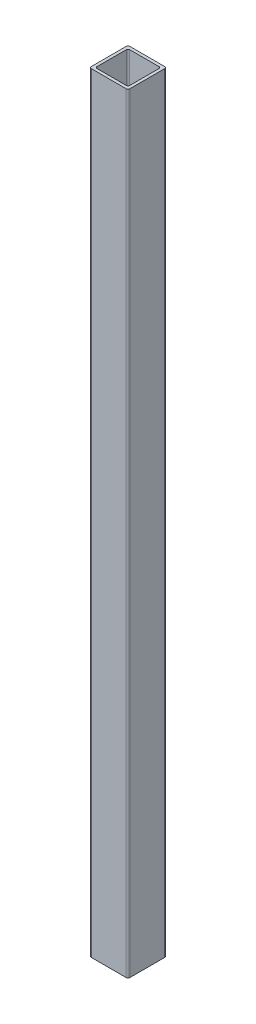
ISO-10303-21;
HEADER;
FILE_DESCRIPTION(('STEP AP214'),'2;1');
FILE_NAME('part.step','',(''),(''),'','','');
FILE_SCHEMA(('AUTOMOTIVE_DESIGN { 1 0 10303 214 1 1 1 1 }'));
ENDSEC;
DATA;
#1=APPLICATION_CONTEXT('core data for automotive mechanical design processes');
#2=APPLICATION_PROTOCOL_DEFINITION('international standard','automotive_design',2000,#1);
#3=PRODUCT_CONTEXT('',#1,'mechanical');
#4=PRODUCT('Part','Part','',(#3));
#5=PRODUCT_RELATED_PRODUCT_CATEGORY('part','',(#4));
#6=PRODUCT_DEFINITION_FORMATION('','',#4);
#7=PRODUCT_DEFINITION_CONTEXT('part definition',#1,'design');
#8=PRODUCT_DEFINITION('design','',#6,#7);
#9=PRODUCT_DEFINITION_SHAPE('','',#8);
#10=(LENGTH_UNIT() NAMED_UNIT(*) SI_UNIT(.MILLI.,.METRE.));
#11=(NAMED_UNIT(*) PLANE_ANGLE_UNIT() SI_UNIT($,.RADIAN.));
#12=(NAMED_UNIT(*) SI_UNIT($,.STERADIAN.) SOLID_ANGLE_UNIT());
#13=UNCERTAINTY_MEASURE_WITH_UNIT(LENGTH_MEASURE(1.E-05),#10,'distance_accuracy_value','');
#14=(GEOMETRIC_REPRESENTATION_CONTEXT(3) GLOBAL_UNCERTAINTY_ASSIGNED_CONTEXT((#13)) GLOBAL_UNIT_ASSIGNED_CONTEXT((#10,
#11,#12)) REPRESENTATION_CONTEXT('',''));
#15=CARTESIAN_POINT('',(0.,0.,0.));
#16=DIRECTION('',(0.,0.,1.));
#17=DIRECTION('',(1.,0.,0.));
#18=AXIS2_PLACEMENT_3D('',#15,#16,#17);
#19=CARTESIAN_POINT('',(-28.575,1270.,-28.575));
#20=DIRECTION('',(0.,-1.,0.));
#21=DIRECTION('',(0.,0.,-1.));
#22=AXIS2_PLACEMENT_3D('',#19,#20,#21);
#23=CYLINDRICAL_SURFACE('',#22,3.175);
#24=CARTESIAN_POINT('',(-28.575,0.,-28.575));
#25=DIRECTION('',(0.,1.,0.));
#26=DIRECTION('',(0.,0.,1.));
#27=AXIS2_PLACEMENT_3D('',#24,#25,#26);
#28=CIRCLE('',#27,3.175);
#29=CARTESIAN_POINT('',(-28.575,0.,-31.75));
#30=VERTEX_POINT('',#29);
#31=CARTESIAN_POINT('',(-31.75,0.,-28.575));
#32=VERTEX_POINT('',#31);
#33=EDGE_CURVE('E252',#30,#32,#28,.T.);
#34=ORIENTED_EDGE('',*,*,#33,.T.);
#35=DIRECTION('',(0.,-1.,0.));
#36=VECTOR('',#35,1.);
#37=CARTESIAN_POINT('',(-31.75,1270.,-28.575));
#38=LINE('',#37,#36);
#39=CARTESIAN_POINT('',(-31.75,1270.,-28.575));
#40=VERTEX_POINT('',#39);
#41=EDGE_CURVE('E12',#40,#32,#38,.T.);
#42=ORIENTED_EDGE('',*,*,#41,.F.);
#43=CARTESIAN_POINT('',(-28.575,1270.,-28.575));
#44=DIRECTION('',(0.,1.,0.));
#45=DIRECTION('',(0.,0.,1.));
#46=AXIS2_PLACEMENT_3D('',#43,#44,#45);
#47=CIRCLE('',#46,3.175);
#48=CARTESIAN_POINT('',(-28.575,1270.,-31.75));
#49=VERTEX_POINT('',#48);
#50=EDGE_CURVE('E358',#49,#40,#47,.T.);
#51=ORIENTED_EDGE('',*,*,#50,.F.);
#52=DIRECTION('',(0.,-1.,0.));
#53=VECTOR('',#52,1.);
#54=CARTESIAN_POINT('',(-28.575,1270.,-31.75));
#55=LINE('',#54,#53);
#56=EDGE_CURVE('E275',#49,#30,#55,.T.);
#57=ORIENTED_EDGE('',*,*,#56,.T.);
#58=EDGE_LOOP('',(#34,#42,#51,#57));
#59=FACE_BOUND('',#58,.T.);
#60=ADVANCED_FACE('F67',(#59),#23,.T.);
#61=CARTESIAN_POINT('',(-31.75,1270.,-28.575));
#62=DIRECTION('',(1.,0.,0.));
#63=DIRECTION('',(0.,0.,-1.));
#64=AXIS2_PLACEMENT_3D('',#61,#62,#63);
#65=PLANE('',#64);
#66=DIRECTION('',(0.,0.,1.));
#67=VECTOR('',#66,1.);
#68=CARTESIAN_POINT('',(-31.75,0.,-28.575));
#69=LINE('',#68,#67);
#70=CARTESIAN_POINT('',(-31.75,0.,28.575));
#71=VERTEX_POINT('',#70);
#72=EDGE_CURVE('E256',#32,#71,#69,.T.);
#73=ORIENTED_EDGE('',*,*,#72,.T.);
#74=DIRECTION('',(0.,-1.,0.));
#75=VECTOR('',#74,1.);
#76=CARTESIAN_POINT('',(-31.75,1270.,28.575));
#77=LINE('',#76,#75);
#78=CARTESIAN_POINT('',(-31.75,1270.,28.575));
#79=VERTEX_POINT('',#78);
#80=EDGE_CURVE('E78',#79,#71,#77,.T.);
#81=ORIENTED_EDGE('',*,*,#80,.F.);
#82=DIRECTION('',(0.,0.,1.));
#83=VECTOR('',#82,1.);
#84=CARTESIAN_POINT('',(-31.75,1270.,-28.575));
#85=LINE('',#84,#83);
#86=EDGE_CURVE('E361',#40,#79,#85,.T.);
#87=ORIENTED_EDGE('',*,*,#86,.F.);
#88=ORIENTED_EDGE('',*,*,#41,.T.);
#89=EDGE_LOOP('',(#73,#81,#87,#88));
#90=FACE_BOUND('',#89,.T.);
#91=ADVANCED_FACE('F400',(#90),#65,.F.);
#92=CARTESIAN_POINT('',(-28.575,1270.,28.575));
#93=DIRECTION('',(0.,-1.,0.));
#94=DIRECTION('',(0.,0.,-1.));
#95=AXIS2_PLACEMENT_3D('',#92,#93,#94);
#96=CYLINDRICAL_SURFACE('',#95,3.175);
#97=CARTESIAN_POINT('',(-28.575,0.,28.575));
#98=DIRECTION('',(0.,1.,0.));
#99=DIRECTION('',(0.,0.,1.));
#100=AXIS2_PLACEMENT_3D('',#97,#98,#99);
#101=CIRCLE('',#100,3.175);
#102=CARTESIAN_POINT('',(-28.575,0.,31.75));
#103=VERTEX_POINT('',#102);
#104=EDGE_CURVE('E259',#71,#103,#101,.T.);
#105=ORIENTED_EDGE('',*,*,#104,.T.);
#106=DIRECTION('',(0.,-1.,0.));
#107=VECTOR('',#106,1.);
#108=CARTESIAN_POINT('',(-28.575,1270.,31.75));
#109=LINE('',#108,#107);
#110=CARTESIAN_POINT('',(-28.575,1270.,31.75));
#111=VERTEX_POINT('',#110);
#112=EDGE_CURVE('E286',#111,#103,#109,.T.);
#113=ORIENTED_EDGE('',*,*,#112,.F.);
#114=CARTESIAN_POINT('',(-28.575,1270.,28.575));
#115=DIRECTION('',(0.,1.,0.));
#116=DIRECTION('',(0.,0.,1.));
#117=AXIS2_PLACEMENT_3D('',#114,#115,#116);
#118=CIRCLE('',#117,3.175);
#119=EDGE_CURVE('E364',#79,#111,#118,.T.);
#120=ORIENTED_EDGE('',*,*,#119,.F.);
#121=ORIENTED_EDGE('',*,*,#80,.T.);
#122=EDGE_LOOP('',(#105,#113,#120,#121));
#123=FACE_BOUND('',#122,.T.);
#124=ADVANCED_FACE('F405',(#123),#96,.T.);
#125=CARTESIAN_POINT('',(-28.575,1270.,31.75));
#126=DIRECTION('',(0.,0.,-1.));
#127=DIRECTION('',(-1.,0.,0.));
#128=AXIS2_PLACEMENT_3D('',#125,#126,#127);
#129=PLANE('',#128);
#130=DIRECTION('',(1.,0.,0.));
#131=VECTOR('',#130,1.);
#132=CARTESIAN_POINT('',(-28.575,0.,31.75));
#133=LINE('',#132,#131);
#134=CARTESIAN_POINT('',(28.575,0.,31.75));
#135=VERTEX_POINT('',#134);
#136=EDGE_CURVE('E262',#103,#135,#133,.T.);
#137=ORIENTED_EDGE('',*,*,#136,.T.);
#138=DIRECTION('',(0.,-1.,0.));
#139=VECTOR('',#138,1.);
#140=CARTESIAN_POINT('',(28.575,1270.,31.75));
#141=LINE('',#140,#139);
#142=CARTESIAN_POINT('',(28.575,1270.,31.75));
#143=VERTEX_POINT('',#142);
#144=EDGE_CURVE('E282',#143,#135,#141,.T.);
#145=ORIENTED_EDGE('',*,*,#144,.F.);
#146=DIRECTION('',(1.,0.,0.));
#147=VECTOR('',#146,1.);
#148=CARTESIAN_POINT('',(-28.575,1270.,31.75));
#149=LINE('',#148,#147);
#150=EDGE_CURVE('E367',#111,#143,#149,.T.);
#151=ORIENTED_EDGE('',*,*,#150,.F.);
#152=ORIENTED_EDGE('',*,*,#112,.T.);
#153=EDGE_LOOP('',(#137,#145,#151,#152));
#154=FACE_BOUND('',#153,.T.);
#155=ADVANCED_FACE('F375',(#154),#129,.F.);
#156=CARTESIAN_POINT('',(28.575,1270.,28.575));
#157=DIRECTION('',(0.,-1.,0.));
#158=DIRECTION('',(0.,0.,-1.));
#159=AXIS2_PLACEMENT_3D('',#156,#157,#158);
#160=CYLINDRICAL_SURFACE('',#159,3.175);
#161=CARTESIAN_POINT('',(28.575,0.,28.575));
#162=DIRECTION('',(0.,1.,0.));
#163=DIRECTION('',(0.,0.,1.));
#164=AXIS2_PLACEMENT_3D('',#161,#162,#163);
#165=CIRCLE('',#164,3.175);
#166=CARTESIAN_POINT('',(31.75,0.,28.575));
#167=VERTEX_POINT('',#166);
#168=EDGE_CURVE('E265',#135,#167,#165,.T.);
#169=ORIENTED_EDGE('',*,*,#168,.T.);
#170=DIRECTION('',(0.,-1.,0.));
#171=VECTOR('',#170,1.);
#172=CARTESIAN_POINT('',(31.75,1270.,28.575));
#173=LINE('',#172,#171);
#174=CARTESIAN_POINT('',(31.75,1270.,28.575));
#175=VERTEX_POINT('',#174);
#176=EDGE_CURVE('E209',#175,#167,#173,.T.);
#177=ORIENTED_EDGE('',*,*,#176,.F.);
#178=CARTESIAN_POINT('',(28.575,1270.,28.575));
#179=DIRECTION('',(0.,1.,0.));
#180=DIRECTION('',(0.,0.,1.));
#181=AXIS2_PLACEMENT_3D('',#178,#179,#180);
#182=CIRCLE('',#181,3.175);
#183=EDGE_CURVE('E198',#143,#175,#182,.T.);
#184=ORIENTED_EDGE('',*,*,#183,.F.);
#185=ORIENTED_EDGE('',*,*,#144,.T.);
#186=EDGE_LOOP('',(#169,#177,#184,#185));
#187=FACE_BOUND('',#186,.T.);
#188=ADVANCED_FACE('F379',(#187),#160,.T.);
#189=CARTESIAN_POINT('',(31.75,1270.,-28.575));
#190=DIRECTION('',(-1.,0.,0.));
#191=DIRECTION('',(0.,0.,1.));
#192=AXIS2_PLACEMENT_3D('',#189,#190,#191);
#193=PLANE('',#192);
#194=DIRECTION('',(0.,0.,-1.));
#195=VECTOR('',#194,1.);
#196=CARTESIAN_POINT('',(31.75,0.,-28.575));
#197=LINE('',#196,#195);
#198=CARTESIAN_POINT('',(31.75,0.,-28.575));
#199=VERTEX_POINT('',#198);
#200=EDGE_CURVE('E207',#167,#199,#197,.T.);
#201=ORIENTED_EDGE('',*,*,#200,.T.);
#202=DIRECTION('',(0.,-1.,0.));
#203=VECTOR('',#202,1.);
#204=CARTESIAN_POINT('',(31.75,1270.,-28.575));
#205=LINE('',#204,#203);
#206=CARTESIAN_POINT('',(31.75,1270.,-28.575));
#207=VERTEX_POINT('',#206);
#208=EDGE_CURVE('E204',#207,#199,#205,.T.);
#209=ORIENTED_EDGE('',*,*,#208,.F.);
#210=DIRECTION('',(0.,0.,-1.));
#211=VECTOR('',#210,1.);
#212=CARTESIAN_POINT('',(31.75,1270.,-28.575));
#213=LINE('',#212,#211);
#214=EDGE_CURVE('E192',#175,#207,#213,.T.);
#215=ORIENTED_EDGE('',*,*,#214,.F.);
#216=ORIENTED_EDGE('',*,*,#176,.T.);
#217=EDGE_LOOP('',(#201,#209,#215,#216));
#218=FACE_BOUND('',#217,.T.);
#219=ADVANCED_FACE('F205',(#218),#193,.F.);
#220=CARTESIAN_POINT('',(28.575,1270.,-28.575));
#221=DIRECTION('',(0.,-1.,0.));
#222=DIRECTION('',(0.,0.,-1.));
#223=AXIS2_PLACEMENT_3D('',#220,#221,#222);
#224=CYLINDRICAL_SURFACE('',#223,3.175);
#225=CARTESIAN_POINT('',(28.575,0.,-28.575));
#226=DIRECTION('',(0.,1.,0.));
#227=DIRECTION('',(0.,0.,-1.));
#228=AXIS2_PLACEMENT_3D('',#225,#226,#227);
#229=CIRCLE('',#228,3.175);
#230=CARTESIAN_POINT('',(28.575,0.,-31.75));
#231=VERTEX_POINT('',#230);
#232=EDGE_CURVE('E140',#199,#231,#229,.T.);
#233=ORIENTED_EDGE('',*,*,#232,.T.);
#234=DIRECTION('',(0.,-1.,0.));
#235=VECTOR('',#234,1.);
#236=CARTESIAN_POINT('',(28.575,1270.,-31.75));
#237=LINE('',#236,#235);
#238=CARTESIAN_POINT('',(28.575,1270.,-31.75));
#239=VERTEX_POINT('',#238);
#240=EDGE_CURVE('E210',#239,#231,#237,.T.);
#241=ORIENTED_EDGE('',*,*,#240,.F.);
#242=CARTESIAN_POINT('',(28.575,1270.,-28.575));
#243=DIRECTION('',(0.,1.,0.));
#244=DIRECTION('',(0.,0.,-1.));
#245=AXIS2_PLACEMENT_3D('',#242,#243,#244);
#246=CIRCLE('',#245,3.175);
#247=EDGE_CURVE('E196',#207,#239,#246,.T.);
#248=ORIENTED_EDGE('',*,*,#247,.F.);
#249=ORIENTED_EDGE('',*,*,#208,.T.);
#250=EDGE_LOOP('',(#233,#241,#248,#249));
#251=FACE_BOUND('',#250,.T.);
#252=ADVANCED_FACE('F212',(#251),#224,.T.);
#253=CARTESIAN_POINT('',(24.27732,1270.,-24.27732));
#254=DIRECTION('',(0.,-1.,0.));
#255=DIRECTION('',(0.,0.,-1.));
#256=AXIS2_PLACEMENT_3D('',#253,#254,#255);
#257=CYLINDRICAL_SURFACE('',#256,2.69748);
#258=CARTESIAN_POINT('',(24.27732,0.,-24.27732));
#259=DIRECTION('',(0.,1.,0.));
#260=DIRECTION('',(0.,0.,-1.));
#261=AXIS2_PLACEMENT_3D('',#258,#259,#260);
#262=CIRCLE('',#261,2.69748);
#263=CARTESIAN_POINT('',(26.9748,0.,-24.27732));
#264=VERTEX_POINT('',#263);
#265=CARTESIAN_POINT('',(24.27732,0.,-26.9748));
#266=VERTEX_POINT('',#265);
#267=EDGE_CURVE('E220',#264,#266,#262,.T.);
#268=ORIENTED_EDGE('',*,*,#267,.F.);
#269=DIRECTION('',(0.,-1.,0.));
#270=VECTOR('',#269,1.);
#271=CARTESIAN_POINT('',(26.9748,1270.,-24.27732));
#272=LINE('',#271,#270);
#273=CARTESIAN_POINT('',(26.9748,1270.,-24.27732));
#274=VERTEX_POINT('',#273);
#275=EDGE_CURVE('E71',#274,#264,#272,.T.);
#276=ORIENTED_EDGE('',*,*,#275,.F.);
#277=CARTESIAN_POINT('',(24.27732,1270.,-24.27732));
#278=DIRECTION('',(0.,1.,0.));
#279=DIRECTION('',(0.,0.,-1.));
#280=AXIS2_PLACEMENT_3D('',#277,#278,#279);
#281=CIRCLE('',#280,2.69748);
#282=CARTESIAN_POINT('',(24.27732,1270.,-26.9748));
#283=VERTEX_POINT('',#282);
#284=EDGE_CURVE('E274',#274,#283,#281,.T.);
#285=ORIENTED_EDGE('',*,*,#284,.T.);
#286=DIRECTION('',(0.,-1.,0.));
#287=VECTOR('',#286,1.);
#288=CARTESIAN_POINT('',(24.27732,1270.,-26.9748));
#289=LINE('',#288,#287);
#290=EDGE_CURVE('E216',#283,#266,#289,.T.);
#291=ORIENTED_EDGE('',*,*,#290,.T.);
#292=EDGE_LOOP('',(#268,#276,#285,#291));
#293=FACE_BOUND('',#292,.T.);
#294=ADVANCED_FACE('F69',(#293),#257,.F.);
#295=CARTESIAN_POINT('',(26.9748,1270.,24.27732));
#296=DIRECTION('',(-1.,0.,0.));
#297=DIRECTION('',(0.,0.,1.));
#298=AXIS2_PLACEMENT_3D('',#295,#296,#297);
#299=PLANE('',#298);
#300=DIRECTION('',(0.,0.,-1.));
#301=VECTOR('',#300,1.);
#302=CARTESIAN_POINT('',(26.9748,0.,24.27732));
#303=LINE('',#302,#301);
#304=CARTESIAN_POINT('',(26.9748,0.,24.27732));
#305=VERTEX_POINT('',#304);
#306=EDGE_CURVE('E224',#305,#264,#303,.T.);
#307=ORIENTED_EDGE('',*,*,#306,.F.);
#308=DIRECTION('',(0.,-1.,0.));
#309=VECTOR('',#308,1.);
#310=CARTESIAN_POINT('',(26.9748,1270.,24.27732));
#311=LINE('',#310,#309);
#312=CARTESIAN_POINT('',(26.9748,1270.,24.27732));
#313=VERTEX_POINT('',#312);
#314=EDGE_CURVE('E309',#313,#305,#311,.T.);
#315=ORIENTED_EDGE('',*,*,#314,.F.);
#316=DIRECTION('',(0.,0.,-1.));
#317=VECTOR('',#316,1.);
#318=CARTESIAN_POINT('',(26.9748,1270.,24.27732));
#319=LINE('',#318,#317);
#320=EDGE_CURVE('E320',#313,#274,#319,.T.);
#321=ORIENTED_EDGE('',*,*,#320,.T.);
#322=ORIENTED_EDGE('',*,*,#275,.T.);
#323=EDGE_LOOP('',(#307,#315,#321,#322));
#324=FACE_BOUND('',#323,.T.);
#325=ADVANCED_FACE('F318',(#324),#299,.T.);
#326=CARTESIAN_POINT('',(24.27732,1270.,24.27732));
#327=DIRECTION('',(0.,-1.,0.));
#328=DIRECTION('',(0.,0.,-1.));
#329=AXIS2_PLACEMENT_3D('',#326,#327,#328);
#330=CYLINDRICAL_SURFACE('',#329,2.69748000000001);
#331=CARTESIAN_POINT('',(24.27732,0.,24.27732));
#332=DIRECTION('',(0.,1.,0.));
#333=DIRECTION('',(0.,0.,1.));
#334=AXIS2_PLACEMENT_3D('',#331,#332,#333);
#335=CIRCLE('',#334,2.69748000000001);
#336=CARTESIAN_POINT('',(24.27732,0.,26.9748));
#337=VERTEX_POINT('',#336);
#338=EDGE_CURVE('E228',#337,#305,#335,.T.);
#339=ORIENTED_EDGE('',*,*,#338,.F.);
#340=DIRECTION('',(0.,-1.,0.));
#341=VECTOR('',#340,1.);
#342=CARTESIAN_POINT('',(24.27732,1270.,26.9748));
#343=LINE('',#342,#341);
#344=CARTESIAN_POINT('',(24.27732,1270.,26.9748));
#345=VERTEX_POINT('',#344);
#346=EDGE_CURVE('E307',#345,#337,#343,.T.);
#347=ORIENTED_EDGE('',*,*,#346,.F.);
#348=CARTESIAN_POINT('',(24.27732,1270.,24.27732));
#349=DIRECTION('',(0.,1.,0.));
#350=DIRECTION('',(0.,0.,1.));
#351=AXIS2_PLACEMENT_3D('',#348,#349,#350);
#352=CIRCLE('',#351,2.69748000000001);
#353=EDGE_CURVE('E328',#345,#313,#352,.T.);
#354=ORIENTED_EDGE('',*,*,#353,.T.);
#355=ORIENTED_EDGE('',*,*,#314,.T.);
#356=EDGE_LOOP('',(#339,#347,#354,#355));
#357=FACE_BOUND('',#356,.T.);
#358=ADVANCED_FACE('F326',(#357),#330,.F.);
#359=CARTESIAN_POINT('',(-24.27732,1270.,26.9748));
#360=DIRECTION('',(0.,0.,-1.));
#361=DIRECTION('',(-1.,0.,0.));
#362=AXIS2_PLACEMENT_3D('',#359,#360,#361);
#363=PLANE('',#362);
#364=DIRECTION('',(1.,0.,0.));
#365=VECTOR('',#364,1.);
#366=CARTESIAN_POINT('',(-24.27732,0.,26.9748));
#367=LINE('',#366,#365);
#368=CARTESIAN_POINT('',(-24.27732,0.,26.9748));
#369=VERTEX_POINT('',#368);
#370=EDGE_CURVE('E232',#369,#337,#367,.T.);
#371=ORIENTED_EDGE('',*,*,#370,.F.);
#372=DIRECTION('',(0.,-1.,0.));
#373=VECTOR('',#372,1.);
#374=CARTESIAN_POINT('',(-24.27732,1270.,26.9748));
#375=LINE('',#374,#373);
#376=CARTESIAN_POINT('',(-24.27732,1270.,26.9748));
#377=VERTEX_POINT('',#376);
#378=EDGE_CURVE('E304',#377,#369,#375,.T.);
#379=ORIENTED_EDGE('',*,*,#378,.F.);
#380=DIRECTION('',(1.,0.,0.));
#381=VECTOR('',#380,1.);
#382=CARTESIAN_POINT('',(-24.27732,1270.,26.9748));
#383=LINE('',#382,#381);
#384=EDGE_CURVE('E334',#377,#345,#383,.T.);
#385=ORIENTED_EDGE('',*,*,#384,.T.);
#386=ORIENTED_EDGE('',*,*,#346,.T.);
#387=EDGE_LOOP('',(#371,#379,#385,#386));
#388=FACE_BOUND('',#387,.T.);
#389=ADVANCED_FACE('F338',(#388),#363,.T.);
#390=CARTESIAN_POINT('',(-24.27732,1270.,24.27732));
#391=DIRECTION('',(0.,-1.,0.));
#392=DIRECTION('',(0.,0.,-1.));
#393=AXIS2_PLACEMENT_3D('',#390,#391,#392);
#394=CYLINDRICAL_SURFACE('',#393,2.69748);
#395=CARTESIAN_POINT('',(-24.27732,0.,24.27732));
#396=DIRECTION('',(0.,1.,0.));
#397=DIRECTION('',(0.,0.,-1.));
#398=AXIS2_PLACEMENT_3D('',#395,#396,#397);
#399=CIRCLE('',#398,2.69748);
#400=CARTESIAN_POINT('',(-26.9748,0.,24.27732));
#401=VERTEX_POINT('',#400);
#402=EDGE_CURVE('E236',#401,#369,#399,.T.);
#403=ORIENTED_EDGE('',*,*,#402,.F.);
#404=DIRECTION('',(0.,-1.,0.));
#405=VECTOR('',#404,1.);
#406=CARTESIAN_POINT('',(-26.9748,1270.,24.27732));
#407=LINE('',#406,#405);
#408=CARTESIAN_POINT('',(-26.9748,1270.,24.27732));
#409=VERTEX_POINT('',#408);
#410=EDGE_CURVE('E301',#409,#401,#407,.T.);
#411=ORIENTED_EDGE('',*,*,#410,.F.);
#412=CARTESIAN_POINT('',(-24.27732,1270.,24.27732));
#413=DIRECTION('',(0.,1.,0.));
#414=DIRECTION('',(0.,0.,-1.));
#415=AXIS2_PLACEMENT_3D('',#412,#413,#414);
#416=CIRCLE('',#415,2.69748);
#417=EDGE_CURVE('E340',#409,#377,#416,.T.);
#418=ORIENTED_EDGE('',*,*,#417,.T.);
#419=ORIENTED_EDGE('',*,*,#378,.T.);
#420=EDGE_LOOP('',(#403,#411,#418,#419));
#421=FACE_BOUND('',#420,.T.);
#422=ADVANCED_FACE('F416',(#421),#394,.F.);
#423=CARTESIAN_POINT('',(-26.9748,1270.,24.27732));
#424=DIRECTION('',(1.,0.,0.));
#425=DIRECTION('',(0.,0.,-1.));
#426=AXIS2_PLACEMENT_3D('',#423,#424,#425);
#427=PLANE('',#426);
#428=DIRECTION('',(0.,0.,1.));
#429=VECTOR('',#428,1.);
#430=CARTESIAN_POINT('',(-26.9748,0.,24.27732));
#431=LINE('',#430,#429);
#432=CARTESIAN_POINT('',(-26.9748,0.,-24.27732));
#433=VERTEX_POINT('',#432);
#434=EDGE_CURVE('E240',#433,#401,#431,.T.);
#435=ORIENTED_EDGE('',*,*,#434,.F.);
#436=DIRECTION('',(0.,-1.,0.));
#437=VECTOR('',#436,1.);
#438=CARTESIAN_POINT('',(-26.9748,1270.,-24.27732));
#439=LINE('',#438,#437);
#440=CARTESIAN_POINT('',(-26.9748,1270.,-24.27732));
#441=VERTEX_POINT('',#440);
#442=EDGE_CURVE('E298',#441,#433,#439,.T.);
#443=ORIENTED_EDGE('',*,*,#442,.F.);
#444=DIRECTION('',(0.,0.,1.));
#445=VECTOR('',#444,1.);
#446=CARTESIAN_POINT('',(-26.9748,1270.,24.27732));
#447=LINE('',#446,#445);
#448=EDGE_CURVE('E343',#441,#409,#447,.T.);
#449=ORIENTED_EDGE('',*,*,#448,.T.);
#450=ORIENTED_EDGE('',*,*,#410,.T.);
#451=EDGE_LOOP('',(#435,#443,#449,#450));
#452=FACE_BOUND('',#451,.T.);
#453=ADVANCED_FACE('F412',(#452),#427,.T.);
#454=CARTESIAN_POINT('',(-24.27732,1270.,-24.27732));
#455=DIRECTION('',(0.,-1.,0.));
#456=DIRECTION('',(0.,0.,-1.));
#457=AXIS2_PLACEMENT_3D('',#454,#455,#456);
#458=CYLINDRICAL_SURFACE('',#457,2.69748);
#459=CARTESIAN_POINT('',(-24.27732,0.,-24.27732));
#460=DIRECTION('',(0.,1.,0.));
#461=DIRECTION('',(0.,0.,-1.));
#462=AXIS2_PLACEMENT_3D('',#459,#460,#461);
#463=CIRCLE('',#462,2.69748);
#464=CARTESIAN_POINT('',(-24.27732,0.,-26.9748));
#465=VERTEX_POINT('',#464);
#466=EDGE_CURVE('E244',#465,#433,#463,.T.);
#467=ORIENTED_EDGE('',*,*,#466,.F.);
#468=DIRECTION('',(0.,-1.,0.));
#469=VECTOR('',#468,1.);
#470=CARTESIAN_POINT('',(-24.27732,1270.,-26.9748));
#471=LINE('',#470,#469);
#472=CARTESIAN_POINT('',(-24.27732,1270.,-26.9748));
#473=VERTEX_POINT('',#472);
#474=EDGE_CURVE('E295',#473,#465,#471,.T.);
#475=ORIENTED_EDGE('',*,*,#474,.F.);
#476=CARTESIAN_POINT('',(-24.27732,1270.,-24.27732));
#477=DIRECTION('',(0.,1.,0.));
#478=DIRECTION('',(0.,0.,-1.));
#479=AXIS2_PLACEMENT_3D('',#476,#477,#478);
#480=CIRCLE('',#479,2.69748);
#481=EDGE_CURVE('E350',#473,#441,#480,.T.);
#482=ORIENTED_EDGE('',*,*,#481,.T.);
#483=ORIENTED_EDGE('',*,*,#442,.T.);
#484=EDGE_LOOP('',(#467,#475,#482,#483));
#485=FACE_BOUND('',#484,.T.);
#486=ADVANCED_FACE('F394',(#485),#458,.F.);
#487=CARTESIAN_POINT('',(-24.27732,1270.,-26.9748));
#488=DIRECTION('',(0.,0.,1.));
#489=DIRECTION('',(1.,0.,0.));
#490=AXIS2_PLACEMENT_3D('',#487,#488,#489);
#491=PLANE('',#490);
#492=DIRECTION('',(-1.,0.,0.));
#493=VECTOR('',#492,1.);
#494=CARTESIAN_POINT('',(-24.27732,0.,-26.9748));
#495=LINE('',#494,#493);
#496=EDGE_CURVE('E248',#266,#465,#495,.T.);
#497=ORIENTED_EDGE('',*,*,#496,.F.);
#498=ORIENTED_EDGE('',*,*,#290,.F.);
#499=DIRECTION('',(-1.,0.,0.));
#500=VECTOR('',#499,1.);
#501=CARTESIAN_POINT('',(-24.27732,1270.,-26.9748));
#502=LINE('',#501,#500);
#503=EDGE_CURVE('E354',#283,#473,#502,.T.);
#504=ORIENTED_EDGE('',*,*,#503,.T.);
#505=ORIENTED_EDGE('',*,*,#474,.T.);
#506=EDGE_LOOP('',(#497,#498,#504,#505));
#507=FACE_BOUND('',#506,.T.);
#508=ADVANCED_FACE('F387',(#507),#491,.T.);
#509=CARTESIAN_POINT('',(-28.575,1270.,-31.75));
#510=DIRECTION('',(0.,0.,1.));
#511=DIRECTION('',(1.,0.,0.));
#512=AXIS2_PLACEMENT_3D('',#509,#510,#511);
#513=PLANE('',#512);
#514=DIRECTION('',(-1.,0.,0.));
#515=VECTOR('',#514,1.);
#516=CARTESIAN_POINT('',(-28.575,0.,-31.75));
#517=LINE('',#516,#515);
#518=EDGE_CURVE('E146',#231,#30,#517,.T.);
#519=ORIENTED_EDGE('',*,*,#518,.T.);
#520=ORIENTED_EDGE('',*,*,#56,.F.);
#521=DIRECTION('',(-1.,0.,0.));
#522=VECTOR('',#521,1.);
#523=CARTESIAN_POINT('',(-28.575,1270.,-31.75));
#524=LINE('',#523,#522);
#525=EDGE_CURVE('E87',#239,#49,#524,.T.);
#526=ORIENTED_EDGE('',*,*,#525,.F.);
#527=ORIENTED_EDGE('',*,*,#240,.T.);
#528=EDGE_LOOP('',(#519,#520,#526,#527));
#529=FACE_BOUND('',#528,.T.);
#530=ADVANCED_FACE('F385',(#529),#513,.F.);
#531=CARTESIAN_POINT('',(-28.575,1270.,-28.575));
#532=DIRECTION('',(0.,1.,0.));
#533=DIRECTION('',(0.,0.,1.));
#534=AXIS2_PLACEMENT_3D('',#531,#532,#533);
#535=PLANE('',#534);
#536=ORIENTED_EDGE('',*,*,#284,.F.);
#537=ORIENTED_EDGE('',*,*,#320,.F.);
#538=ORIENTED_EDGE('',*,*,#353,.F.);
#539=ORIENTED_EDGE('',*,*,#384,.F.);
#540=ORIENTED_EDGE('',*,*,#417,.F.);
#541=ORIENTED_EDGE('',*,*,#448,.F.);
#542=ORIENTED_EDGE('',*,*,#481,.F.);
#543=ORIENTED_EDGE('',*,*,#503,.F.);
#544=EDGE_LOOP('',(#536,#537,#538,#539,#540,#541,#542,#543));
#545=FACE_BOUND('',#544,.T.);
#546=ORIENTED_EDGE('',*,*,#50,.T.);
#547=ORIENTED_EDGE('',*,*,#86,.T.);
#548=ORIENTED_EDGE('',*,*,#119,.T.);
#549=ORIENTED_EDGE('',*,*,#150,.T.);
#550=ORIENTED_EDGE('',*,*,#183,.T.);
#551=ORIENTED_EDGE('',*,*,#214,.T.);
#552=ORIENTED_EDGE('',*,*,#247,.T.);
#553=ORIENTED_EDGE('',*,*,#525,.T.);
#554=EDGE_LOOP('',(#546,#547,#548,#549,#550,#551,#552,#553));
#555=FACE_BOUND('',#554,.T.);
#556=ADVANCED_FACE('F194',(#545,#555),#535,.T.);
#557=CARTESIAN_POINT('',(-28.575,0.,-28.575));
#558=DIRECTION('',(0.,1.,0.));
#559=DIRECTION('',(0.,0.,1.));
#560=AXIS2_PLACEMENT_3D('',#557,#558,#559);
#561=PLANE('',#560);
#562=ORIENTED_EDGE('',*,*,#267,.T.);
#563=ORIENTED_EDGE('',*,*,#496,.T.);
#564=ORIENTED_EDGE('',*,*,#466,.T.);
#565=ORIENTED_EDGE('',*,*,#434,.T.);
#566=ORIENTED_EDGE('',*,*,#402,.T.);
#567=ORIENTED_EDGE('',*,*,#370,.T.);
#568=ORIENTED_EDGE('',*,*,#338,.T.);
#569=ORIENTED_EDGE('',*,*,#306,.T.);
#570=EDGE_LOOP('',(#562,#563,#564,#565,#566,#567,#568,#569));
#571=FACE_BOUND('',#570,.T.);
#572=ORIENTED_EDGE('',*,*,#33,.F.);
#573=ORIENTED_EDGE('',*,*,#518,.F.);
#574=ORIENTED_EDGE('',*,*,#232,.F.);
#575=ORIENTED_EDGE('',*,*,#200,.F.);
#576=ORIENTED_EDGE('',*,*,#168,.F.);
#577=ORIENTED_EDGE('',*,*,#136,.F.);
#578=ORIENTED_EDGE('',*,*,#104,.F.);
#579=ORIENTED_EDGE('',*,*,#72,.F.);
#580=EDGE_LOOP('',(#572,#573,#574,#575,#576,#577,#578,#579));
#581=FACE_BOUND('',#580,.T.);
#582=ADVANCED_FACE('F323',(#571,#581),#561,.F.);
#583=CLOSED_SHELL('',(#60,#91,#124,#155,#188,#219,#252,#294,#325,#358,#389,#422,#453,#486,#508,
#530,#556,#582));
#584=MANIFOLD_SOLID_BREP('B2',#583);
#585=ADVANCED_BREP_SHAPE_REPRESENTATION('',(#18,#584),#14);
#586=SHAPE_DEFINITION_REPRESENTATION(#9,#585);
ENDSEC;
END-ISO-10303-21;
